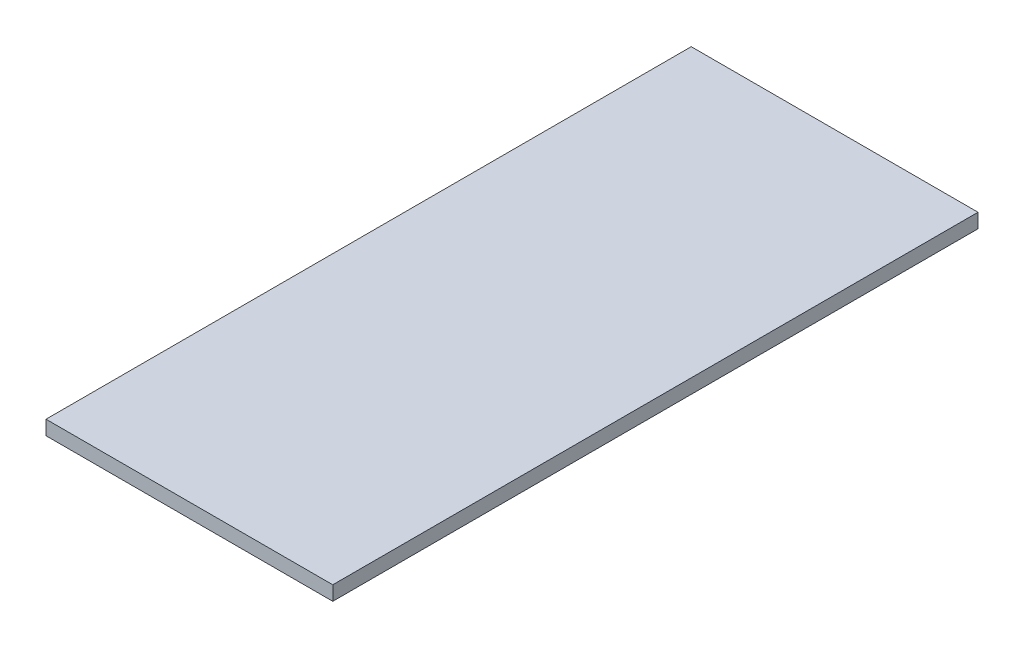
ISO-10303-21;
HEADER;
FILE_DESCRIPTION(('STEP AP214'),'2;1');
FILE_NAME('part.step','',(''),(''),'','','');
FILE_SCHEMA(('AUTOMOTIVE_DESIGN { 1 0 10303 214 1 1 1 1 }'));
ENDSEC;
DATA;
#1=APPLICATION_CONTEXT('core data for automotive mechanical design processes');
#2=APPLICATION_PROTOCOL_DEFINITION('international standard','automotive_design',2000,#1);
#3=PRODUCT_CONTEXT('',#1,'mechanical');
#4=PRODUCT('Part','Part','',(#3));
#5=PRODUCT_RELATED_PRODUCT_CATEGORY('part','',(#4));
#6=PRODUCT_DEFINITION_FORMATION('','',#4);
#7=PRODUCT_DEFINITION_CONTEXT('part definition',#1,'design');
#8=PRODUCT_DEFINITION('design','',#6,#7);
#9=PRODUCT_DEFINITION_SHAPE('','',#8);
#10=(LENGTH_UNIT() NAMED_UNIT(*) SI_UNIT(.MILLI.,.METRE.));
#11=(NAMED_UNIT(*) PLANE_ANGLE_UNIT() SI_UNIT($,.RADIAN.));
#12=(NAMED_UNIT(*) SI_UNIT($,.STERADIAN.) SOLID_ANGLE_UNIT());
#13=UNCERTAINTY_MEASURE_WITH_UNIT(LENGTH_MEASURE(1.E-05),#10,'distance_accuracy_value','');
#14=(GEOMETRIC_REPRESENTATION_CONTEXT(3) GLOBAL_UNCERTAINTY_ASSIGNED_CONTEXT((#13)) GLOBAL_UNIT_ASSIGNED_CONTEXT((#10,
#11,#12)) REPRESENTATION_CONTEXT('',''));
#15=CARTESIAN_POINT('',(0.,0.,0.));
#16=DIRECTION('',(0.,0.,1.));
#17=DIRECTION('',(1.,0.,0.));
#18=AXIS2_PLACEMENT_3D('',#15,#16,#17);
#19=CARTESIAN_POINT('',(0.,2.54,0.));
#20=DIRECTION('',(1.,0.,0.));
#21=DIRECTION('',(0.,0.,-1.));
#22=AXIS2_PLACEMENT_3D('',#19,#20,#21);
#23=PLANE('',#22);
#24=DIRECTION('',(0.,0.,1.));
#25=VECTOR('',#24,1.);
#26=CARTESIAN_POINT('',(0.,0.,0.));
#27=LINE('',#26,#25);
#28=CARTESIAN_POINT('',(0.,0.,-114.3));
#29=VERTEX_POINT('',#28);
#30=CARTESIAN_POINT('',(0.,0.,0.));
#31=VERTEX_POINT('',#30);
#32=EDGE_CURVE('E96',#29,#31,#27,.T.);
#33=ORIENTED_EDGE('',*,*,#32,.T.);
#34=DIRECTION('',(0.,-1.,0.));
#35=VECTOR('',#34,1.);
#36=CARTESIAN_POINT('',(0.,2.54,0.));
#37=LINE('',#36,#35);
#38=CARTESIAN_POINT('',(0.,2.54,0.));
#39=VERTEX_POINT('',#38);
#40=EDGE_CURVE('E11',#39,#31,#37,.T.);
#41=ORIENTED_EDGE('',*,*,#40,.F.);
#42=DIRECTION('',(0.,0.,1.));
#43=VECTOR('',#42,1.);
#44=CARTESIAN_POINT('',(0.,2.54,0.));
#45=LINE('',#44,#43);
#46=CARTESIAN_POINT('',(0.,2.54,-114.3));
#47=VERTEX_POINT('',#46);
#48=EDGE_CURVE('E84',#47,#39,#45,.T.);
#49=ORIENTED_EDGE('',*,*,#48,.F.);
#50=DIRECTION('',(0.,-1.,0.));
#51=VECTOR('',#50,1.);
#52=CARTESIAN_POINT('',(0.,2.54,-114.3));
#53=LINE('',#52,#51);
#54=EDGE_CURVE('E92',#47,#29,#53,.T.);
#55=ORIENTED_EDGE('',*,*,#54,.T.);
#56=EDGE_LOOP('',(#33,#41,#49,#55));
#57=FACE_BOUND('',#56,.T.);
#58=ADVANCED_FACE('F33',(#57),#23,.F.);
#59=CARTESIAN_POINT('',(0.,2.54,0.));
#60=DIRECTION('',(0.,0.,-1.));
#61=DIRECTION('',(-1.,0.,0.));
#62=AXIS2_PLACEMENT_3D('',#59,#60,#61);
#63=PLANE('',#62);
#64=DIRECTION('',(1.,0.,0.));
#65=VECTOR('',#64,1.);
#66=CARTESIAN_POINT('',(0.,0.,0.));
#67=LINE('',#66,#65);
#68=CARTESIAN_POINT('',(50.8,0.,0.));
#69=VERTEX_POINT('',#68);
#70=EDGE_CURVE('E88',#31,#69,#67,.T.);
#71=ORIENTED_EDGE('',*,*,#70,.T.);
#72=DIRECTION('',(0.,-1.,0.));
#73=VECTOR('',#72,1.);
#74=CARTESIAN_POINT('',(50.8,2.54,0.));
#75=LINE('',#74,#73);
#76=CARTESIAN_POINT('',(50.8,2.54,0.));
#77=VERTEX_POINT('',#76);
#78=EDGE_CURVE('E41',#77,#69,#75,.T.);
#79=ORIENTED_EDGE('',*,*,#78,.F.);
#80=DIRECTION('',(1.,0.,0.));
#81=VECTOR('',#80,1.);
#82=CARTESIAN_POINT('',(0.,2.54,0.));
#83=LINE('',#82,#81);
#84=EDGE_CURVE('E79',#39,#77,#83,.T.);
#85=ORIENTED_EDGE('',*,*,#84,.F.);
#86=ORIENTED_EDGE('',*,*,#40,.T.);
#87=EDGE_LOOP('',(#71,#79,#85,#86));
#88=FACE_BOUND('',#87,.T.);
#89=ADVANCED_FACE('F87',(#88),#63,.F.);
#90=CARTESIAN_POINT('',(50.8,2.54,0.));
#91=DIRECTION('',(-1.,0.,0.));
#92=DIRECTION('',(0.,0.,1.));
#93=AXIS2_PLACEMENT_3D('',#90,#91,#92);
#94=PLANE('',#93);
#95=DIRECTION('',(0.,0.,-1.));
#96=VECTOR('',#95,1.);
#97=CARTESIAN_POINT('',(50.8,0.,0.));
#98=LINE('',#97,#96);
#99=CARTESIAN_POINT('',(50.8,0.,-114.3));
#100=VERTEX_POINT('',#99);
#101=EDGE_CURVE('E66',#69,#100,#98,.T.);
#102=ORIENTED_EDGE('',*,*,#101,.T.);
#103=DIRECTION('',(0.,-1.,0.));
#104=VECTOR('',#103,1.);
#105=CARTESIAN_POINT('',(50.8,2.54,-114.3));
#106=LINE('',#105,#104);
#107=CARTESIAN_POINT('',(50.8,2.54,-114.3));
#108=VERTEX_POINT('',#107);
#109=EDGE_CURVE('E89',#108,#100,#106,.T.);
#110=ORIENTED_EDGE('',*,*,#109,.F.);
#111=DIRECTION('',(0.,0.,-1.));
#112=VECTOR('',#111,1.);
#113=CARTESIAN_POINT('',(50.8,2.54,0.));
#114=LINE('',#113,#112);
#115=EDGE_CURVE('E82',#77,#108,#114,.T.);
#116=ORIENTED_EDGE('',*,*,#115,.F.);
#117=ORIENTED_EDGE('',*,*,#78,.T.);
#118=EDGE_LOOP('',(#102,#110,#116,#117));
#119=FACE_BOUND('',#118,.T.);
#120=ADVANCED_FACE('F90',(#119),#94,.F.);
#121=CARTESIAN_POINT('',(0.,2.54,-114.3));
#122=DIRECTION('',(0.,0.,1.));
#123=DIRECTION('',(1.,0.,0.));
#124=AXIS2_PLACEMENT_3D('',#121,#122,#123);
#125=PLANE('',#124);
#126=DIRECTION('',(-1.,0.,0.));
#127=VECTOR('',#126,1.);
#128=CARTESIAN_POINT('',(0.,0.,-114.3));
#129=LINE('',#128,#127);
#130=EDGE_CURVE('E72',#100,#29,#129,.T.);
#131=ORIENTED_EDGE('',*,*,#130,.T.);
#132=ORIENTED_EDGE('',*,*,#54,.F.);
#133=DIRECTION('',(-1.,0.,0.));
#134=VECTOR('',#133,1.);
#135=CARTESIAN_POINT('',(0.,2.54,-114.3));
#136=LINE('',#135,#134);
#137=EDGE_CURVE('E49',#108,#47,#136,.T.);
#138=ORIENTED_EDGE('',*,*,#137,.F.);
#139=ORIENTED_EDGE('',*,*,#109,.T.);
#140=EDGE_LOOP('',(#131,#132,#138,#139));
#141=FACE_BOUND('',#140,.T.);
#142=ADVANCED_FACE('F103',(#141),#125,.F.);
#143=CARTESIAN_POINT('',(0.,2.54,0.));
#144=DIRECTION('',(0.,-1.,0.));
#145=DIRECTION('',(0.,0.,-1.));
#146=AXIS2_PLACEMENT_3D('',#143,#144,#145);
#147=PLANE('',#146);
#148=ORIENTED_EDGE('',*,*,#48,.T.);
#149=ORIENTED_EDGE('',*,*,#84,.T.);
#150=ORIENTED_EDGE('',*,*,#115,.T.);
#151=ORIENTED_EDGE('',*,*,#137,.T.);
#152=EDGE_LOOP('',(#148,#149,#150,#151));
#153=FACE_BOUND('',#152,.T.);
#154=ADVANCED_FACE('F80',(#153),#147,.F.);
#155=CARTESIAN_POINT('',(0.,0.,0.));
#156=DIRECTION('',(0.,-1.,0.));
#157=DIRECTION('',(0.,0.,-1.));
#158=AXIS2_PLACEMENT_3D('',#155,#156,#157);
#159=PLANE('',#158);
#160=ORIENTED_EDGE('',*,*,#32,.F.);
#161=ORIENTED_EDGE('',*,*,#130,.F.);
#162=ORIENTED_EDGE('',*,*,#101,.F.);
#163=ORIENTED_EDGE('',*,*,#70,.F.);
#164=EDGE_LOOP('',(#160,#161,#162,#163));
#165=FACE_BOUND('',#164,.T.);
#166=ADVANCED_FACE('F106',(#165),#159,.T.);
#167=CLOSED_SHELL('',(#58,#89,#120,#142,#154,#166));
#168=MANIFOLD_SOLID_BREP('B2',#167);
#169=ADVANCED_BREP_SHAPE_REPRESENTATION('',(#18,#168),#14);
#170=SHAPE_DEFINITION_REPRESENTATION(#9,#169);
ENDSEC;
END-ISO-10303-21;
